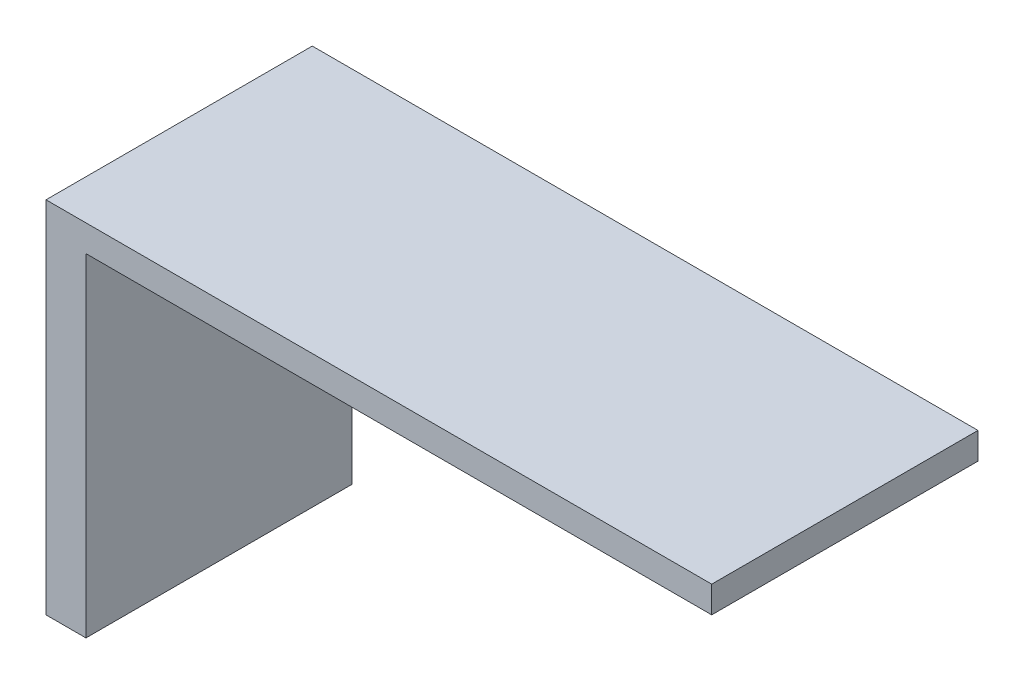
ISO-10303-21;
HEADER;
FILE_DESCRIPTION(('STEP AP214'),'2;1');
FILE_NAME('part.step','',(''),(''),'','','');
FILE_SCHEMA(('AUTOMOTIVE_DESIGN { 1 0 10303 214 1 1 1 1 }'));
ENDSEC;
DATA;
#1=APPLICATION_CONTEXT('core data for automotive mechanical design processes');
#2=APPLICATION_PROTOCOL_DEFINITION('international standard','automotive_design',2000,#1);
#3=PRODUCT_CONTEXT('',#1,'mechanical');
#4=PRODUCT('Part','Part','',(#3));
#5=PRODUCT_RELATED_PRODUCT_CATEGORY('part','',(#4));
#6=PRODUCT_DEFINITION_FORMATION('','',#4);
#7=PRODUCT_DEFINITION_CONTEXT('part definition',#1,'design');
#8=PRODUCT_DEFINITION('design','',#6,#7);
#9=PRODUCT_DEFINITION_SHAPE('','',#8);
#10=(LENGTH_UNIT() NAMED_UNIT(*) SI_UNIT(.MILLI.,.METRE.));
#11=(NAMED_UNIT(*) PLANE_ANGLE_UNIT() SI_UNIT($,.RADIAN.));
#12=(NAMED_UNIT(*) SI_UNIT($,.STERADIAN.) SOLID_ANGLE_UNIT());
#13=UNCERTAINTY_MEASURE_WITH_UNIT(LENGTH_MEASURE(1.E-05),#10,'distance_accuracy_value','');
#14=(GEOMETRIC_REPRESENTATION_CONTEXT(3) GLOBAL_UNCERTAINTY_ASSIGNED_CONTEXT((#13)) GLOBAL_UNIT_ASSIGNED_CONTEXT((#10,
#11,#12)) REPRESENTATION_CONTEXT('',''));
#15=CARTESIAN_POINT('',(0.,0.,0.));
#16=DIRECTION('',(0.,0.,1.));
#17=DIRECTION('',(1.,0.,0.));
#18=AXIS2_PLACEMENT_3D('',#15,#16,#17);
#19=CARTESIAN_POINT('',(0.,2.,0.));
#20=DIRECTION('',(1.,0.,0.));
#21=DIRECTION('',(0.,0.,-1.));
#22=AXIS2_PLACEMENT_3D('',#19,#20,#21);
#23=PLANE('',#22);
#24=DIRECTION('',(0.,-1.,0.));
#25=VECTOR('',#24,1.);
#26=CARTESIAN_POINT('',(0.,2.,-20.));
#27=LINE('',#26,#25);
#28=CARTESIAN_POINT('',(0.,2.,-20.));
#29=VERTEX_POINT('',#28);
#30=CARTESIAN_POINT('',(0.,-25.,-20.));
#31=VERTEX_POINT('',#30);
#32=EDGE_CURVE('E95',#29,#31,#27,.T.);
#33=ORIENTED_EDGE('',*,*,#32,.T.);
#34=DIRECTION('',(0.,0.,-1.));
#35=VECTOR('',#34,1.);
#36=CARTESIAN_POINT('',(0.,-25.,0.));
#37=LINE('',#36,#35);
#38=CARTESIAN_POINT('',(0.,-25.,0.));
#39=VERTEX_POINT('',#38);
#40=EDGE_CURVE('E99',#39,#31,#37,.T.);
#41=ORIENTED_EDGE('',*,*,#40,.F.);
#42=DIRECTION('',(0.,-1.,0.));
#43=VECTOR('',#42,1.);
#44=CARTESIAN_POINT('',(0.,2.,0.));
#45=LINE('',#44,#43);
#46=CARTESIAN_POINT('',(0.,2.,0.));
#47=VERTEX_POINT('',#46);
#48=EDGE_CURVE('E11',#47,#39,#45,.T.);
#49=ORIENTED_EDGE('',*,*,#48,.F.);
#50=DIRECTION('',(0.,0.,1.));
#51=VECTOR('',#50,1.);
#52=CARTESIAN_POINT('',(0.,2.,0.));
#53=LINE('',#52,#51);
#54=EDGE_CURVE('E100',#29,#47,#53,.T.);
#55=ORIENTED_EDGE('',*,*,#54,.F.);
#56=EDGE_LOOP('',(#33,#41,#49,#55));
#57=FACE_BOUND('',#56,.T.);
#58=ADVANCED_FACE('F33',(#57),#23,.F.);
#59=CARTESIAN_POINT('',(0.,2.,0.));
#60=DIRECTION('',(0.,0.,-1.));
#61=DIRECTION('',(-1.,0.,0.));
#62=AXIS2_PLACEMENT_3D('',#59,#60,#61);
#63=PLANE('',#62);
#64=ORIENTED_EDGE('',*,*,#48,.T.);
#65=DIRECTION('',(-1.,0.,0.));
#66=VECTOR('',#65,1.);
#67=CARTESIAN_POINT('',(0.,-25.,0.));
#68=LINE('',#67,#66);
#69=CARTESIAN_POINT('',(3.,-25.,0.));
#70=VERTEX_POINT('',#69);
#71=EDGE_CURVE('E116',#70,#39,#68,.T.);
#72=ORIENTED_EDGE('',*,*,#71,.F.);
#73=DIRECTION('',(0.,1.,0.));
#74=VECTOR('',#73,1.);
#75=CARTESIAN_POINT('',(3.,-25.,0.));
#76=LINE('',#75,#74);
#77=CARTESIAN_POINT('',(3.,0.,0.));
#78=VERTEX_POINT('',#77);
#79=EDGE_CURVE('E121',#70,#78,#76,.T.);
#80=ORIENTED_EDGE('',*,*,#79,.T.);
#81=DIRECTION('',(1.,0.,0.));
#82=VECTOR('',#81,1.);
#83=CARTESIAN_POINT('',(0.,0.,0.));
#84=LINE('',#83,#82);
#85=CARTESIAN_POINT('',(50.,0.,0.));
#86=VERTEX_POINT('',#85);
#87=EDGE_CURVE('E126',#78,#86,#84,.T.);
#88=ORIENTED_EDGE('',*,*,#87,.T.);
#89=DIRECTION('',(0.,-1.,0.));
#90=VECTOR('',#89,1.);
#91=CARTESIAN_POINT('',(50.,2.,0.));
#92=LINE('',#91,#90);
#93=CARTESIAN_POINT('',(50.,2.,0.));
#94=VERTEX_POINT('',#93);
#95=EDGE_CURVE('E40',#94,#86,#92,.T.);
#96=ORIENTED_EDGE('',*,*,#95,.F.);
#97=DIRECTION('',(1.,0.,0.));
#98=VECTOR('',#97,1.);
#99=CARTESIAN_POINT('',(0.,2.,0.));
#100=LINE('',#99,#98);
#101=EDGE_CURVE('E79',#47,#94,#100,.T.);
#102=ORIENTED_EDGE('',*,*,#101,.F.);
#103=EDGE_LOOP('',(#64,#72,#80,#88,#96,#102));
#104=FACE_BOUND('',#103,.T.);
#105=ADVANCED_FACE('F142',(#104),#63,.F.);
#106=CARTESIAN_POINT('',(50.,2.,0.));
#107=DIRECTION('',(-1.,0.,0.));
#108=DIRECTION('',(0.,0.,1.));
#109=AXIS2_PLACEMENT_3D('',#106,#107,#108);
#110=PLANE('',#109);
#111=DIRECTION('',(0.,0.,-1.));
#112=VECTOR('',#111,1.);
#113=CARTESIAN_POINT('',(50.,0.,0.));
#114=LINE('',#113,#112);
#115=CARTESIAN_POINT('',(50.,0.,-20.));
#116=VERTEX_POINT('',#115);
#117=EDGE_CURVE('E72',#86,#116,#114,.T.);
#118=ORIENTED_EDGE('',*,*,#117,.T.);
#119=DIRECTION('',(0.,-1.,0.));
#120=VECTOR('',#119,1.);
#121=CARTESIAN_POINT('',(50.,2.,-20.));
#122=LINE('',#121,#120);
#123=CARTESIAN_POINT('',(50.,2.,-20.));
#124=VERTEX_POINT('',#123);
#125=EDGE_CURVE('E102',#124,#116,#122,.T.);
#126=ORIENTED_EDGE('',*,*,#125,.F.);
#127=DIRECTION('',(0.,0.,-1.));
#128=VECTOR('',#127,1.);
#129=CARTESIAN_POINT('',(50.,2.,0.));
#130=LINE('',#129,#128);
#131=EDGE_CURVE('E130',#94,#124,#130,.T.);
#132=ORIENTED_EDGE('',*,*,#131,.F.);
#133=ORIENTED_EDGE('',*,*,#95,.T.);
#134=EDGE_LOOP('',(#118,#126,#132,#133));
#135=FACE_BOUND('',#134,.T.);
#136=ADVANCED_FACE('F137',(#135),#110,.F.);
#137=CARTESIAN_POINT('',(0.,2.,-20.));
#138=DIRECTION('',(0.,0.,1.));
#139=DIRECTION('',(1.,0.,0.));
#140=AXIS2_PLACEMENT_3D('',#137,#138,#139);
#141=PLANE('',#140);
#142=DIRECTION('',(-1.,0.,0.));
#143=VECTOR('',#142,1.);
#144=CARTESIAN_POINT('',(0.,0.,-20.));
#145=LINE('',#144,#143);
#146=CARTESIAN_POINT('',(3.,0.,-20.));
#147=VERTEX_POINT('',#146);
#148=EDGE_CURVE('E128',#116,#147,#145,.T.);
#149=ORIENTED_EDGE('',*,*,#148,.T.);
#150=DIRECTION('',(0.,1.,0.));
#151=VECTOR('',#150,1.);
#152=CARTESIAN_POINT('',(3.,-25.,-20.));
#153=LINE('',#152,#151);
#154=CARTESIAN_POINT('',(3.,-25.,-20.));
#155=VERTEX_POINT('',#154);
#156=EDGE_CURVE('E108',#155,#147,#153,.T.);
#157=ORIENTED_EDGE('',*,*,#156,.F.);
#158=DIRECTION('',(1.,0.,0.));
#159=VECTOR('',#158,1.);
#160=CARTESIAN_POINT('',(0.,-25.,-20.));
#161=LINE('',#160,#159);
#162=EDGE_CURVE('E105',#31,#155,#161,.T.);
#163=ORIENTED_EDGE('',*,*,#162,.F.);
#164=ORIENTED_EDGE('',*,*,#32,.F.);
#165=DIRECTION('',(-1.,0.,0.));
#166=VECTOR('',#165,1.);
#167=CARTESIAN_POINT('',(0.,2.,-20.));
#168=LINE('',#167,#166);
#169=EDGE_CURVE('E56',#124,#29,#168,.T.);
#170=ORIENTED_EDGE('',*,*,#169,.F.);
#171=ORIENTED_EDGE('',*,*,#125,.T.);
#172=EDGE_LOOP('',(#149,#157,#163,#164,#170,#171));
#173=FACE_BOUND('',#172,.T.);
#174=ADVANCED_FACE('F106',(#173),#141,.F.);
#175=CARTESIAN_POINT('',(0.,2.,0.));
#176=DIRECTION('',(0.,-1.,0.));
#177=DIRECTION('',(0.,0.,-1.));
#178=AXIS2_PLACEMENT_3D('',#175,#176,#177);
#179=PLANE('',#178);
#180=ORIENTED_EDGE('',*,*,#54,.T.);
#181=ORIENTED_EDGE('',*,*,#101,.T.);
#182=ORIENTED_EDGE('',*,*,#131,.T.);
#183=ORIENTED_EDGE('',*,*,#169,.T.);
#184=EDGE_LOOP('',(#180,#181,#182,#183));
#185=FACE_BOUND('',#184,.T.);
#186=ADVANCED_FACE('F152',(#185),#179,.F.);
#187=CARTESIAN_POINT('',(0.,0.,0.));
#188=DIRECTION('',(0.,-1.,0.));
#189=DIRECTION('',(0.,0.,-1.));
#190=AXIS2_PLACEMENT_3D('',#187,#188,#189);
#191=PLANE('',#190);
#192=DIRECTION('',(0.,0.,1.));
#193=VECTOR('',#192,1.);
#194=CARTESIAN_POINT('',(3.,0.,0.));
#195=LINE('',#194,#193);
#196=EDGE_CURVE('E47',#147,#78,#195,.T.);
#197=ORIENTED_EDGE('',*,*,#196,.F.);
#198=ORIENTED_EDGE('',*,*,#148,.F.);
#199=ORIENTED_EDGE('',*,*,#117,.F.);
#200=ORIENTED_EDGE('',*,*,#87,.F.);
#201=EDGE_LOOP('',(#197,#198,#199,#200));
#202=FACE_BOUND('',#201,.T.);
#203=ADVANCED_FACE('F138',(#202),#191,.T.);
#204=CARTESIAN_POINT('',(3.,-25.,0.));
#205=DIRECTION('',(-1.,0.,0.));
#206=DIRECTION('',(0.,0.,1.));
#207=AXIS2_PLACEMENT_3D('',#204,#205,#206);
#208=PLANE('',#207);
#209=ORIENTED_EDGE('',*,*,#196,.T.);
#210=ORIENTED_EDGE('',*,*,#79,.F.);
#211=DIRECTION('',(0.,0.,1.));
#212=VECTOR('',#211,1.);
#213=CARTESIAN_POINT('',(3.,-25.,0.));
#214=LINE('',#213,#212);
#215=EDGE_CURVE('E111',#155,#70,#214,.T.);
#216=ORIENTED_EDGE('',*,*,#215,.F.);
#217=ORIENTED_EDGE('',*,*,#156,.T.);
#218=EDGE_LOOP('',(#209,#210,#216,#217));
#219=FACE_BOUND('',#218,.T.);
#220=ADVANCED_FACE('F140',(#219),#208,.F.);
#221=CARTESIAN_POINT('',(0.,-25.,0.));
#222=DIRECTION('',(0.,-1.,0.));
#223=DIRECTION('',(0.,0.,-1.));
#224=AXIS2_PLACEMENT_3D('',#221,#222,#223);
#225=PLANE('',#224);
#226=ORIENTED_EDGE('',*,*,#40,.T.);
#227=ORIENTED_EDGE('',*,*,#162,.T.);
#228=ORIENTED_EDGE('',*,*,#215,.T.);
#229=ORIENTED_EDGE('',*,*,#71,.T.);
#230=EDGE_LOOP('',(#226,#227,#228,#229));
#231=FACE_BOUND('',#230,.T.);
#232=ADVANCED_FACE('F114',(#231),#225,.T.);
#233=CLOSED_SHELL('',(#58,#105,#136,#174,#186,#203,#220,#232));
#234=MANIFOLD_SOLID_BREP('B2',#233);
#235=ADVANCED_BREP_SHAPE_REPRESENTATION('',(#18,#234),#14);
#236=SHAPE_DEFINITION_REPRESENTATION(#9,#235);
ENDSEC;
END-ISO-10303-21;
